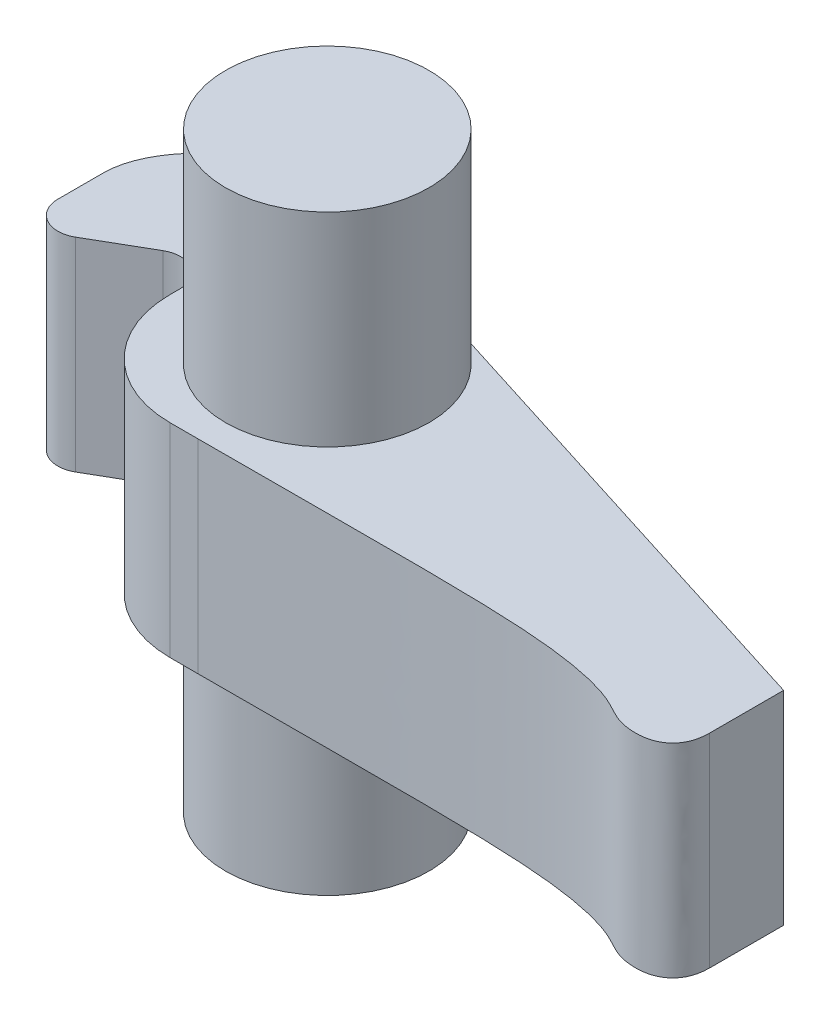
ISO-10303-21;
HEADER;
FILE_DESCRIPTION(('STEP AP214'),'2;1');
FILE_NAME('part.step','',(''),(''),'','','');
FILE_SCHEMA(('AUTOMOTIVE_DESIGN { 1 0 10303 214 1 1 1 1 }'));
ENDSEC;
DATA;
#1=APPLICATION_CONTEXT('core data for automotive mechanical design processes');
#2=APPLICATION_PROTOCOL_DEFINITION('international standard','automotive_design',2000,#1);
#3=PRODUCT_CONTEXT('',#1,'mechanical');
#4=PRODUCT('Part','Part','',(#3));
#5=PRODUCT_RELATED_PRODUCT_CATEGORY('part','',(#4));
#6=PRODUCT_DEFINITION_FORMATION('','',#4);
#7=PRODUCT_DEFINITION_CONTEXT('part definition',#1,'design');
#8=PRODUCT_DEFINITION('design','',#6,#7);
#9=PRODUCT_DEFINITION_SHAPE('','',#8);
#10=(LENGTH_UNIT() NAMED_UNIT(*) SI_UNIT(.MILLI.,.METRE.));
#11=(NAMED_UNIT(*) PLANE_ANGLE_UNIT() SI_UNIT($,.RADIAN.));
#12=(NAMED_UNIT(*) SI_UNIT($,.STERADIAN.) SOLID_ANGLE_UNIT());
#13=UNCERTAINTY_MEASURE_WITH_UNIT(LENGTH_MEASURE(1.E-05),#10,'distance_accuracy_value','');
#14=(GEOMETRIC_REPRESENTATION_CONTEXT(3) GLOBAL_UNCERTAINTY_ASSIGNED_CONTEXT((#13)) GLOBAL_UNIT_ASSIGNED_CONTEXT((#10,
#11,#12)) REPRESENTATION_CONTEXT('',''));
#15=CARTESIAN_POINT('',(0.,0.,0.));
#16=DIRECTION('',(0.,0.,1.));
#17=DIRECTION('',(1.,0.,0.));
#18=AXIS2_PLACEMENT_3D('',#15,#16,#17);
#19=CARTESIAN_POINT('',(-3.,2.2,0.));
#20=DIRECTION('',(1.,0.,0.));
#21=DIRECTION('',(0.,0.,-1.));
#22=AXIS2_PLACEMENT_3D('',#19,#20,#21);
#23=PLANE('',#22);
#24=DIRECTION('',(0.,0.,1.));
#25=VECTOR('',#24,1.);
#26=CARTESIAN_POINT('',(-3.,0.,0.));
#27=LINE('',#26,#25);
#28=CARTESIAN_POINT('',(-3.,0.,-0.587196294450365));
#29=VERTEX_POINT('',#28);
#30=CARTESIAN_POINT('',(-3.,0.,-0.086393689756276));
#31=VERTEX_POINT('',#30);
#32=EDGE_CURVE('E220',#29,#31,#27,.T.);
#33=ORIENTED_EDGE('',*,*,#32,.T.);
#34=DIRECTION('',(0.,-1.,0.));
#35=VECTOR('',#34,1.);
#36=CARTESIAN_POINT('',(-3.,2.2,-0.086393689756276));
#37=LINE('',#36,#35);
#38=CARTESIAN_POINT('',(-3.,2.2,-0.086393689756276));
#39=VERTEX_POINT('',#38);
#40=EDGE_CURVE('E275',#39,#31,#37,.T.);
#41=ORIENTED_EDGE('',*,*,#40,.F.);
#42=DIRECTION('',(0.,0.,1.));
#43=VECTOR('',#42,1.);
#44=CARTESIAN_POINT('',(-3.,2.2,0.));
#45=LINE('',#44,#43);
#46=CARTESIAN_POINT('',(-3.,2.2,-0.587196294450365));
#47=VERTEX_POINT('',#46);
#48=EDGE_CURVE('E280',#47,#39,#45,.T.);
#49=ORIENTED_EDGE('',*,*,#48,.F.);
#50=DIRECTION('',(0.,-1.,0.));
#51=VECTOR('',#50,1.);
#52=CARTESIAN_POINT('',(-3.,2.2,-0.587196294450365));
#53=LINE('',#52,#51);
#54=EDGE_CURVE('E96',#47,#29,#53,.T.);
#55=ORIENTED_EDGE('',*,*,#54,.T.);
#56=EDGE_LOOP('',(#33,#41,#49,#55));
#57=FACE_BOUND('',#56,.T.);
#58=ADVANCED_FACE('F87',(#57),#23,.F.);
#59=CARTESIAN_POINT('',(-2.7,2.2,-0.086393689756276));
#60=DIRECTION('',(0.,-1.,0.));
#61=DIRECTION('',(0.,0.,-1.));
#62=AXIS2_PLACEMENT_3D('',#59,#60,#61);
#63=CYLINDRICAL_SURFACE('',#62,0.3);
#64=CARTESIAN_POINT('',(-2.7,0.,-0.086393689756276));
#65=DIRECTION('',(0.,1.,0.));
#66=DIRECTION('',(0.,0.,1.));
#67=AXIS2_PLACEMENT_3D('',#64,#65,#66);
#68=CIRCLE('',#67,0.3);
#69=CARTESIAN_POINT('',(-2.55,0.,0.173413931379054));
#70=VERTEX_POINT('',#69);
#71=EDGE_CURVE('E225',#31,#70,#68,.T.);
#72=ORIENTED_EDGE('',*,*,#71,.T.);
#73=DIRECTION('',(0.,-1.,0.));
#74=VECTOR('',#73,1.);
#75=CARTESIAN_POINT('',(-2.55,2.2,0.173413931379054));
#76=LINE('',#75,#74);
#77=CARTESIAN_POINT('',(-2.55,2.2,0.173413931379054));
#78=VERTEX_POINT('',#77);
#79=EDGE_CURVE('E272',#78,#70,#76,.T.);
#80=ORIENTED_EDGE('',*,*,#79,.F.);
#81=CARTESIAN_POINT('',(-2.7,2.2,-0.086393689756276));
#82=DIRECTION('',(0.,1.,0.));
#83=DIRECTION('',(0.,0.,1.));
#84=AXIS2_PLACEMENT_3D('',#81,#82,#83);
#85=CIRCLE('',#84,0.3);
#86=EDGE_CURVE('E348',#39,#78,#85,.T.);
#87=ORIENTED_EDGE('',*,*,#86,.F.);
#88=ORIENTED_EDGE('',*,*,#40,.T.);
#89=EDGE_LOOP('',(#72,#80,#87,#88));
#90=FACE_BOUND('',#89,.T.);
#91=ADVANCED_FACE('F297',(#90),#63,.T.);
#92=CARTESIAN_POINT('',(-0.562409565027815,2.2,-0.974121941290875));
#93=DIRECTION('',(-0.500000000000005,0.,-0.866025403784436));
#94=DIRECTION('',(-0.866025403784436,0.,0.500000000000005));
#95=AXIS2_PLACEMENT_3D('',#92,#93,#94);
#96=PLANE('',#95);
#97=DIRECTION('',(0.866025403784436,0.,-0.500000000000005));
#98=VECTOR('',#97,1.);
#99=CARTESIAN_POINT('',(-0.562409565027815,0.,-0.974121941290875));
#100=LINE('',#99,#98);
#101=CARTESIAN_POINT('',(-1.95,0.,-0.172996230134723));
#102=VERTEX_POINT('',#101);
#103=EDGE_CURVE('E227',#70,#102,#100,.T.);
#104=ORIENTED_EDGE('',*,*,#103,.T.);
#105=DIRECTION('',(0.,-1.,0.));
#106=VECTOR('',#105,1.);
#107=CARTESIAN_POINT('',(-1.95,2.2,-0.172996230134723));
#108=LINE('',#107,#106);
#109=CARTESIAN_POINT('',(-1.95,2.2,-0.172996230134723));
#110=VERTEX_POINT('',#109);
#111=EDGE_CURVE('E269',#110,#102,#108,.T.);
#112=ORIENTED_EDGE('',*,*,#111,.F.);
#113=DIRECTION('',(0.866025403784436,0.,-0.500000000000005));
#114=VECTOR('',#113,1.);
#115=CARTESIAN_POINT('',(-0.562409565027815,2.2,-0.974121941290875));
#116=LINE('',#115,#114);
#117=EDGE_CURVE('E346',#78,#110,#116,.T.);
#118=ORIENTED_EDGE('',*,*,#117,.F.);
#119=ORIENTED_EDGE('',*,*,#79,.T.);
#120=EDGE_LOOP('',(#104,#112,#118,#119));
#121=FACE_BOUND('',#120,.T.);
#122=ADVANCED_FACE('F301',(#121),#96,.F.);
#123=CARTESIAN_POINT('',(-1.8,2.2,0.0868113910006078));
#124=DIRECTION('',(0.,-1.,0.));
#125=DIRECTION('',(0.,0.,-1.));
#126=AXIS2_PLACEMENT_3D('',#123,#124,#125);
#127=CYLINDRICAL_SURFACE('',#126,0.3);
#128=CARTESIAN_POINT('',(-1.8,0.,0.0868113910006078));
#129=DIRECTION('',(0.,1.,0.));
#130=DIRECTION('',(0.,0.,1.));
#131=AXIS2_PLACEMENT_3D('',#128,#129,#130);
#132=CIRCLE('',#131,0.3);
#133=CARTESIAN_POINT('',(-1.5,0.,0.0868113910006077));
#134=VERTEX_POINT('',#133);
#135=EDGE_CURVE('E229',#102,#134,#132,.F.);
#136=ORIENTED_EDGE('',*,*,#135,.T.);
#137=DIRECTION('',(0.,-1.,0.));
#138=VECTOR('',#137,1.);
#139=CARTESIAN_POINT('',(-1.5,2.2,0.0868113910006077));
#140=LINE('',#139,#138);
#141=CARTESIAN_POINT('',(-1.5,2.2,0.0868113910006077));
#142=VERTEX_POINT('',#141);
#143=EDGE_CURVE('E266',#142,#134,#140,.T.);
#144=ORIENTED_EDGE('',*,*,#143,.F.);
#145=CARTESIAN_POINT('',(-1.8,2.2,0.0868113910006078));
#146=DIRECTION('',(0.,1.,0.));
#147=DIRECTION('',(0.,0.,1.));
#148=AXIS2_PLACEMENT_3D('',#145,#146,#147);
#149=CIRCLE('',#148,0.3);
#150=EDGE_CURVE('E344',#110,#142,#149,.F.);
#151=ORIENTED_EDGE('',*,*,#150,.F.);
#152=ORIENTED_EDGE('',*,*,#111,.T.);
#153=EDGE_LOOP('',(#136,#144,#151,#152));
#154=FACE_BOUND('',#153,.T.);
#155=ADVANCED_FACE('F307',(#154),#127,.F.);
#156=CARTESIAN_POINT('',(-1.5,2.2,0.));
#157=DIRECTION('',(1.,0.,0.));
#158=DIRECTION('',(0.,0.,-1.));
#159=AXIS2_PLACEMENT_3D('',#156,#157,#158);
#160=PLANE('',#159);
#161=DIRECTION('',(0.,0.,1.));
#162=VECTOR('',#161,1.);
#163=CARTESIAN_POINT('',(-1.5,0.,0.));
#164=LINE('',#163,#162);
#165=CARTESIAN_POINT('',(-1.5,0.,0.2));
#166=VERTEX_POINT('',#165);
#167=EDGE_CURVE('E231',#134,#166,#164,.T.);
#168=ORIENTED_EDGE('',*,*,#167,.T.);
#169=DIRECTION('',(0.,-1.,0.));
#170=VECTOR('',#169,1.);
#171=CARTESIAN_POINT('',(-1.5,2.2,0.2));
#172=LINE('',#171,#170);
#173=CARTESIAN_POINT('',(-1.5,2.2,0.2));
#174=VERTEX_POINT('',#173);
#175=EDGE_CURVE('E264',#174,#166,#172,.T.);
#176=ORIENTED_EDGE('',*,*,#175,.F.);
#177=DIRECTION('',(0.,0.,1.));
#178=VECTOR('',#177,1.);
#179=CARTESIAN_POINT('',(-1.5,2.2,0.));
#180=LINE('',#179,#178);
#181=EDGE_CURVE('E342',#142,#174,#180,.T.);
#182=ORIENTED_EDGE('',*,*,#181,.F.);
#183=ORIENTED_EDGE('',*,*,#143,.T.);
#184=EDGE_LOOP('',(#168,#176,#182,#183));
#185=FACE_BOUND('',#184,.T.);
#186=ADVANCED_FACE('F311',(#185),#160,.F.);
#187=CARTESIAN_POINT('',(-0.3,2.2,0.2));
#188=DIRECTION('',(0.,-1.,0.));
#189=DIRECTION('',(0.,0.,-1.));
#190=AXIS2_PLACEMENT_3D('',#187,#188,#189);
#191=CYLINDRICAL_SURFACE('',#190,1.2);
#192=CARTESIAN_POINT('',(-0.3,0.,0.2));
#193=DIRECTION('',(0.,1.,0.));
#194=DIRECTION('',(0.,0.,1.));
#195=AXIS2_PLACEMENT_3D('',#192,#193,#194);
#196=CIRCLE('',#195,1.2);
#197=CARTESIAN_POINT('',(-0.3,0.,1.4));
#198=VERTEX_POINT('',#197);
#199=EDGE_CURVE('E234',#198,#166,#196,.F.);
#200=ORIENTED_EDGE('',*,*,#199,.F.);
#201=DIRECTION('',(0.,-1.,0.));
#202=VECTOR('',#201,1.);
#203=CARTESIAN_POINT('',(-0.3,2.2,1.4));
#204=LINE('',#203,#202);
#205=CARTESIAN_POINT('',(-0.3,2.2,1.4));
#206=VERTEX_POINT('',#205);
#207=EDGE_CURVE('E262',#206,#198,#204,.T.);
#208=ORIENTED_EDGE('',*,*,#207,.F.);
#209=CARTESIAN_POINT('',(-0.3,2.2,0.2));
#210=DIRECTION('',(0.,1.,0.));
#211=DIRECTION('',(0.,0.,1.));
#212=AXIS2_PLACEMENT_3D('',#209,#210,#211);
#213=CIRCLE('',#212,1.2);
#214=EDGE_CURVE('E339',#206,#174,#213,.F.);
#215=ORIENTED_EDGE('',*,*,#214,.T.);
#216=ORIENTED_EDGE('',*,*,#175,.T.);
#217=EDGE_LOOP('',(#200,#208,#215,#216));
#218=FACE_BOUND('',#217,.T.);
#219=ADVANCED_FACE('F315',(#218),#191,.T.);
#220=CARTESIAN_POINT('',(0.,2.2,1.4));
#221=DIRECTION('',(0.,0.,1.));
#222=DIRECTION('',(1.,0.,0.));
#223=AXIS2_PLACEMENT_3D('',#220,#221,#222);
#224=PLANE('',#223);
#225=DIRECTION('',(-1.,0.,0.));
#226=VECTOR('',#225,1.);
#227=CARTESIAN_POINT('',(0.,0.,1.4));
#228=LINE('',#227,#226);
#229=CARTESIAN_POINT('',(0.,0.,1.4));
#230=VERTEX_POINT('',#229);
#231=EDGE_CURVE('E237',#230,#198,#228,.T.);
#232=ORIENTED_EDGE('',*,*,#231,.F.);
#233=DIRECTION('',(0.,-1.,0.));
#234=VECTOR('',#233,1.);
#235=CARTESIAN_POINT('',(0.,2.2,1.4));
#236=LINE('',#235,#234);
#237=CARTESIAN_POINT('',(0.,2.2,1.4));
#238=VERTEX_POINT('',#237);
#239=EDGE_CURVE('E260',#238,#230,#236,.T.);
#240=ORIENTED_EDGE('',*,*,#239,.F.);
#241=DIRECTION('',(-1.,0.,0.));
#242=VECTOR('',#241,1.);
#243=CARTESIAN_POINT('',(0.,2.2,1.4));
#244=LINE('',#243,#242);
#245=EDGE_CURVE('E333',#238,#206,#244,.T.);
#246=ORIENTED_EDGE('',*,*,#245,.T.);
#247=ORIENTED_EDGE('',*,*,#207,.T.);
#248=EDGE_LOOP('',(#232,#240,#246,#247));
#249=FACE_BOUND('',#248,.T.);
#250=ADVANCED_FACE('F319',(#249),#224,.T.);
#251=CARTESIAN_POINT('',(5.52358793930377,2.2,1.38916862779242));
#252=CARTESIAN_POINT('',(5.52358793930377,2.2,1.65564458196359));
#253=CARTESIAN_POINT('',(5.31087633005542,2.2,1.8018261596441));
#254=CARTESIAN_POINT('',(4.79158078462507,2.2,1.77336774710911));
#255=CARTESIAN_POINT('',(4.77273176011014,2.2,1.59674075043952));
#256=CARTESIAN_POINT('',(3.41513568844589,2.2,1.36800850713413));
#257=CARTESIAN_POINT('',(2.10000000000128,2.2,1.4));
#258=CARTESIAN_POINT('',(0.,2.2,1.4));
#259=B_SPLINE_CURVE_WITH_KNOTS('',3,(#251,#252,#253,#254,#255,#256,#257,#258),.UNSPECIFIED.,.F.,
.F.,(4,1,1,1,1,4),(0.,0.200930821168348,0.262112326290482,0.572959192895685,0.650633546099201,
1.),.UNSPECIFIED.);
#260=DIRECTION('',(0.,-1.,0.));
#261=VECTOR('',#260,1.);
#262=SURFACE_OF_LINEAR_EXTRUSION('',#259,#261);
#263=CARTESIAN_POINT('',(5.52358793930377,0.,1.38916862779242));
#264=CARTESIAN_POINT('',(5.52358793930377,0.,1.65564458196359));
#265=CARTESIAN_POINT('',(5.31087633005542,0.,1.8018261596441));
#266=CARTESIAN_POINT('',(4.79158078462507,0.,1.77336774710911));
#267=CARTESIAN_POINT('',(4.77273176011014,0.,1.59674075043952));
#268=CARTESIAN_POINT('',(3.41513568844589,0.,1.36800850713413));
#269=CARTESIAN_POINT('',(2.10000000000128,0.,1.4));
#270=CARTESIAN_POINT('',(0.,0.,1.4));
#271=B_SPLINE_CURVE_WITH_KNOTS('',3,(#263,#264,#265,#266,#267,#268,#269,#270),.UNSPECIFIED.,.F.,
.F.,(4,1,1,1,1,4),(0.,0.200930821168348,0.262112326290482,0.572959192895685,0.650633546099201,
1.),.UNSPECIFIED.);
#272=CARTESIAN_POINT('',(5.52358793930377,0.,1.38916862779242));
#273=VERTEX_POINT('',#272);
#274=EDGE_CURVE('E240',#273,#230,#271,.T.);
#275=ORIENTED_EDGE('',*,*,#274,.F.);
#276=DIRECTION('',(0.,-1.,0.));
#277=VECTOR('',#276,1.);
#278=CARTESIAN_POINT('',(5.52358793930377,2.2,1.38916862779242));
#279=LINE('',#278,#277);
#280=CARTESIAN_POINT('',(5.52358793930377,2.2,1.38916862779242));
#281=VERTEX_POINT('',#280);
#282=EDGE_CURVE('E197',#281,#273,#279,.T.);
#283=ORIENTED_EDGE('',*,*,#282,.F.);
#284=EDGE_CURVE('E208',#281,#238,#259,.T.);
#285=ORIENTED_EDGE('',*,*,#284,.T.);
#286=ORIENTED_EDGE('',*,*,#239,.T.);
#287=EDGE_LOOP('',(#275,#283,#285,#286));
#288=FACE_BOUND('',#287,.T.);
#289=ADVANCED_FACE('F323',(#288),#262,.T.);
#290=CARTESIAN_POINT('',(5.52358793930377,2.2,0.));
#291=DIRECTION('',(1.,0.,0.));
#292=DIRECTION('',(0.,0.,-1.));
#293=AXIS2_PLACEMENT_3D('',#290,#291,#292);
#294=PLANE('',#293);
#295=DIRECTION('',(0.,0.,1.));
#296=VECTOR('',#295,1.);
#297=CARTESIAN_POINT('',(5.52358793930377,0.,0.));
#298=LINE('',#297,#296);
#299=CARTESIAN_POINT('',(5.52358793930377,0.,0.589168627792421));
#300=VERTEX_POINT('',#299);
#301=EDGE_CURVE('E193',#300,#273,#298,.T.);
#302=ORIENTED_EDGE('',*,*,#301,.F.);
#303=DIRECTION('',(0.,-1.,0.));
#304=VECTOR('',#303,1.);
#305=CARTESIAN_POINT('',(5.52358793930377,2.2,0.589168627792421));
#306=LINE('',#305,#304);
#307=CARTESIAN_POINT('',(5.52358793930377,2.2,0.589168627792421));
#308=VERTEX_POINT('',#307);
#309=EDGE_CURVE('E188',#308,#300,#306,.T.);
#310=ORIENTED_EDGE('',*,*,#309,.F.);
#311=DIRECTION('',(0.,0.,1.));
#312=VECTOR('',#311,1.);
#313=CARTESIAN_POINT('',(5.52358793930377,2.2,0.));
#314=LINE('',#313,#312);
#315=EDGE_CURVE('E191',#308,#281,#314,.T.);
#316=ORIENTED_EDGE('',*,*,#315,.T.);
#317=ORIENTED_EDGE('',*,*,#282,.T.);
#318=EDGE_LOOP('',(#302,#310,#316,#317));
#319=FACE_BOUND('',#318,.T.);
#320=ADVANCED_FACE('F190',(#319),#294,.T.);
#321=CARTESIAN_POINT('',(0.33049817253701,2.2,-1.04820628620895));
#322=DIRECTION('',(0.300705799504267,0.,-0.953716950748229));
#323=DIRECTION('',(-0.953716950748229,0.,-0.300705799504267));
#324=AXIS2_PLACEMENT_3D('',#321,#322,#323);
#325=PLANE('',#324);
#326=DIRECTION('',(0.953716950748229,0.,0.300705799504267));
#327=VECTOR('',#326,1.);
#328=CARTESIAN_POINT('',(0.33049817253701,0.,-1.04820628620895));
#329=LINE('',#328,#327);
#330=CARTESIAN_POINT('',(0.373516405263338,0.,-1.03464268953062));
#331=VERTEX_POINT('',#330);
#332=EDGE_CURVE('E249',#331,#300,#329,.T.);
#333=ORIENTED_EDGE('',*,*,#332,.F.);
#334=DIRECTION('',(0.,-1.,0.));
#335=VECTOR('',#334,1.);
#336=CARTESIAN_POINT('',(0.373516405263338,2.2,-1.03464268953062));
#337=LINE('',#336,#335);
#338=CARTESIAN_POINT('',(0.37351640526333,2.2,-1.03464268953062));
#339=VERTEX_POINT('',#338);
#340=EDGE_CURVE('E198',#339,#331,#337,.T.);
#341=ORIENTED_EDGE('',*,*,#340,.F.);
#342=DIRECTION('',(0.953716950748229,0.,0.300705799504267));
#343=VECTOR('',#342,1.);
#344=CARTESIAN_POINT('',(0.33049817253701,2.2,-1.04820628620895));
#345=LINE('',#344,#343);
#346=EDGE_CURVE('E204',#339,#308,#345,.T.);
#347=ORIENTED_EDGE('',*,*,#346,.T.);
#348=ORIENTED_EDGE('',*,*,#309,.T.);
#349=EDGE_LOOP('',(#333,#341,#347,#348));
#350=FACE_BOUND('',#349,.T.);
#351=ADVANCED_FACE('F210',(#350),#325,.T.);
#352=CARTESIAN_POINT('',(0.33049817253701,2.2,-1.04820628620895));
#353=DIRECTION('',(-0.300705799504267,0.,0.953716950748229));
#354=DIRECTION('',(0.953716950748229,0.,0.300705799504267));
#355=AXIS2_PLACEMENT_3D('',#352,#353,#354);
#356=PLANE('',#355);
#357=DIRECTION('',(-0.953716950748229,0.,-0.300705799504267));
#358=VECTOR('',#357,1.);
#359=CARTESIAN_POINT('',(0.33049817253701,0.,-1.04820628620895));
#360=LINE('',#359,#358);
#361=CARTESIAN_POINT('',(0.287479939810679,0.,-1.06176988288727));
#362=VERTEX_POINT('',#361);
#363=CARTESIAN_POINT('',(-1.53391749623312,0.,-1.63605428853915));
#364=VERTEX_POINT('',#363);
#365=EDGE_CURVE('E251',#362,#364,#360,.T.);
#366=ORIENTED_EDGE('',*,*,#365,.T.);
#367=DIRECTION('',(0.,-1.,0.));
#368=VECTOR('',#367,1.);
#369=CARTESIAN_POINT('',(-1.53391749623312,2.2,-1.63605428853915));
#370=LINE('',#369,#368);
#371=CARTESIAN_POINT('',(-1.53391749623312,2.2,-1.63605428853915));
#372=VERTEX_POINT('',#371);
#373=EDGE_CURVE('E153',#372,#364,#370,.T.);
#374=ORIENTED_EDGE('',*,*,#373,.F.);
#375=DIRECTION('',(-0.953716950748229,0.,-0.300705799504267));
#376=VECTOR('',#375,1.);
#377=CARTESIAN_POINT('',(0.33049817253701,2.2,-1.04820628620895));
#378=LINE('',#377,#376);
#379=CARTESIAN_POINT('',(0.28747993981069,2.2,-1.06176988288727));
#380=VERTEX_POINT('',#379);
#381=EDGE_CURVE('E104',#380,#372,#378,.T.);
#382=ORIENTED_EDGE('',*,*,#381,.F.);
#383=DIRECTION('',(0.,-1.,0.));
#384=VECTOR('',#383,1.);
#385=CARTESIAN_POINT('',(0.28747993981069,2.2,-1.06176988288727));
#386=LINE('',#385,#384);
#387=EDGE_CURVE('E255',#380,#362,#386,.T.);
#388=ORIENTED_EDGE('',*,*,#387,.T.);
#389=EDGE_LOOP('',(#366,#374,#382,#388));
#390=FACE_BOUND('',#389,.T.);
#391=ADVANCED_FACE('F286',(#390),#356,.F.);
#392=CARTESIAN_POINT('',(-3.,2.2,-0.587196294450365));
#393=CARTESIAN_POINT('',(-2.99309316393838,2.2,-1.20502359302415));
#394=CARTESIAN_POINT('',(-2.17796828739402,2.2,-1.83912272296873));
#395=CARTESIAN_POINT('',(-1.53391749623312,2.2,-1.63605428853915));
#396=B_SPLINE_CURVE_WITH_KNOTS('',3,(#392,#393,#394,#395),.UNSPECIFIED.,.F.,.F.,(4,4),(0.,1.),.UNSPECIFIED.);
#397=DIRECTION('',(0.,-1.,0.));
#398=VECTOR('',#397,1.);
#399=SURFACE_OF_LINEAR_EXTRUSION('',#396,#398);
#400=CARTESIAN_POINT('',(-3.,0.,-0.587196294450365));
#401=CARTESIAN_POINT('',(-2.99309316393838,0.,-1.20502359302415));
#402=CARTESIAN_POINT('',(-2.17796828739402,0.,-1.83912272296873));
#403=CARTESIAN_POINT('',(-1.53391749623312,0.,-1.63605428853915));
#404=B_SPLINE_CURVE_WITH_KNOTS('',3,(#400,#401,#402,#403),.UNSPECIFIED.,.F.,.F.,(4,4),(0.,1.),.UNSPECIFIED.);
#405=EDGE_CURVE('E215',#29,#364,#404,.T.);
#406=ORIENTED_EDGE('',*,*,#405,.F.);
#407=ORIENTED_EDGE('',*,*,#54,.F.);
#408=EDGE_CURVE('E253',#47,#372,#396,.T.);
#409=ORIENTED_EDGE('',*,*,#408,.T.);
#410=ORIENTED_EDGE('',*,*,#373,.T.);
#411=EDGE_LOOP('',(#406,#407,#409,#410));
#412=FACE_BOUND('',#411,.T.);
#413=ADVANCED_FACE('F284',(#412),#399,.T.);
#414=CARTESIAN_POINT('',(0.,0.,0.));
#415=DIRECTION('',(0.,1.,0.));
#416=DIRECTION('',(0.,0.,1.));
#417=AXIS2_PLACEMENT_3D('',#414,#415,#416);
#418=PLANE('',#417);
#419=ORIENTED_EDGE('',*,*,#365,.F.);
#420=CARTESIAN_POINT('',(0.,0.,0.));
#421=DIRECTION('',(0.,1.,0.));
#422=DIRECTION('',(0.,0.,1.));
#423=AXIS2_PLACEMENT_3D('',#420,#421,#422);
#424=CIRCLE('',#423,1.1);
#425=EDGE_CURVE('E146',#362,#331,#424,.T.);
#426=ORIENTED_EDGE('',*,*,#425,.T.);
#427=ORIENTED_EDGE('',*,*,#332,.T.);
#428=ORIENTED_EDGE('',*,*,#301,.T.);
#429=ORIENTED_EDGE('',*,*,#274,.T.);
#430=ORIENTED_EDGE('',*,*,#231,.T.);
#431=ORIENTED_EDGE('',*,*,#199,.T.);
#432=ORIENTED_EDGE('',*,*,#167,.F.);
#433=ORIENTED_EDGE('',*,*,#135,.F.);
#434=ORIENTED_EDGE('',*,*,#103,.F.);
#435=ORIENTED_EDGE('',*,*,#71,.F.);
#436=ORIENTED_EDGE('',*,*,#32,.F.);
#437=ORIENTED_EDGE('',*,*,#405,.T.);
#438=EDGE_LOOP('',(#419,#426,#427,#428,#429,#430,#431,#432,#433,#434,#435,#436,#437));
#439=FACE_BOUND('',#438,.T.);
#440=ADVANCED_FACE('F282',(#439),#418,.F.);
#441=CARTESIAN_POINT('',(0.,2.2,0.));
#442=DIRECTION('',(0.,1.,0.));
#443=DIRECTION('',(0.,0.,1.));
#444=AXIS2_PLACEMENT_3D('',#441,#442,#443);
#445=PLANE('',#444);
#446=CARTESIAN_POINT('',(0.,2.2,0.));
#447=DIRECTION('',(0.,1.,0.));
#448=DIRECTION('',(0.,0.,1.));
#449=AXIS2_PLACEMENT_3D('',#446,#447,#448);
#450=CIRCLE('',#449,1.1);
#451=EDGE_CURVE('E12',#380,#339,#450,.T.);
#452=ORIENTED_EDGE('',*,*,#451,.F.);
#453=ORIENTED_EDGE('',*,*,#381,.T.);
#454=ORIENTED_EDGE('',*,*,#408,.F.);
#455=ORIENTED_EDGE('',*,*,#48,.T.);
#456=ORIENTED_EDGE('',*,*,#86,.T.);
#457=ORIENTED_EDGE('',*,*,#117,.T.);
#458=ORIENTED_EDGE('',*,*,#150,.T.);
#459=ORIENTED_EDGE('',*,*,#181,.T.);
#460=ORIENTED_EDGE('',*,*,#214,.F.);
#461=ORIENTED_EDGE('',*,*,#245,.F.);
#462=ORIENTED_EDGE('',*,*,#284,.F.);
#463=ORIENTED_EDGE('',*,*,#315,.F.);
#464=ORIENTED_EDGE('',*,*,#346,.F.);
#465=EDGE_LOOP('',(#452,#453,#454,#455,#456,#457,#458,#459,#460,#461,#462,#463,#464));
#466=FACE_BOUND('',#465,.T.);
#467=ADVANCED_FACE('F202',(#466),#445,.T.);
#468=CARTESIAN_POINT('',(0.,2.2,0.));
#469=DIRECTION('',(0.,-1.,0.));
#470=DIRECTION('',(0.,0.,-1.));
#471=AXIS2_PLACEMENT_3D('',#468,#469,#470);
#472=CYLINDRICAL_SURFACE('',#471,1.1);
#473=ORIENTED_EDGE('',*,*,#340,.T.);
#474=ORIENTED_EDGE('',*,*,#425,.F.);
#475=ORIENTED_EDGE('',*,*,#387,.F.);
#476=ORIENTED_EDGE('',*,*,#451,.T.);
#477=EDGE_LOOP('',(#473,#474,#475,#476));
#478=FACE_BOUND('',#477,.T.);
#479=CARTESIAN_POINT('',(0.,4.4,0.));
#480=DIRECTION('',(0.,1.,0.));
#481=DIRECTION('',(0.,0.,1.));
#482=AXIS2_PLACEMENT_3D('',#479,#480,#481);
#483=CIRCLE('',#482,1.1);
#484=CARTESIAN_POINT('',(0.,4.4,1.1));
#485=VERTEX_POINT('',#484);
#486=EDGE_CURVE('E361',#485,#485,#483,.T.);
#487=ORIENTED_EDGE('',*,*,#486,.F.);
#488=EDGE_LOOP('',(#487));
#489=FACE_BOUND('',#488,.T.);
#490=CARTESIAN_POINT('',(0.,-2.,0.));
#491=DIRECTION('',(0.,1.,0.));
#492=DIRECTION('',(0.,0.,1.));
#493=AXIS2_PLACEMENT_3D('',#490,#491,#492);
#494=CIRCLE('',#493,1.1);
#495=CARTESIAN_POINT('',(0.,-2.,1.1));
#496=VERTEX_POINT('',#495);
#497=EDGE_CURVE('E358',#496,#496,#494,.T.);
#498=ORIENTED_EDGE('',*,*,#497,.T.);
#499=EDGE_LOOP('',(#498));
#500=FACE_BOUND('',#499,.T.);
#501=ADVANCED_FACE('F89',(#478,#489,#500),#472,.T.);
#502=CARTESIAN_POINT('',(0.,4.4,0.));
#503=DIRECTION('',(0.,1.,0.));
#504=DIRECTION('',(0.,0.,1.));
#505=AXIS2_PLACEMENT_3D('',#502,#503,#504);
#506=PLANE('',#505);
#507=ORIENTED_EDGE('',*,*,#486,.T.);
#508=EDGE_LOOP('',(#507));
#509=FACE_BOUND('',#508,.T.);
#510=ADVANCED_FACE('F365',(#509),#506,.T.);
#511=CARTESIAN_POINT('',(0.,-2.,0.));
#512=DIRECTION('',(0.,1.,0.));
#513=DIRECTION('',(0.,0.,1.));
#514=AXIS2_PLACEMENT_3D('',#511,#512,#513);
#515=PLANE('',#514);
#516=ORIENTED_EDGE('',*,*,#497,.F.);
#517=EDGE_LOOP('',(#516));
#518=FACE_BOUND('',#517,.T.);
#519=ADVANCED_FACE('F372',(#518),#515,.F.);
#520=CLOSED_SHELL('',(#58,#91,#122,#155,#186,#219,#250,#289,#320,#351,#391,#413,#440,#467,#501,
#510,#519));
#521=MANIFOLD_SOLID_BREP('B2',#520);
#522=ADVANCED_BREP_SHAPE_REPRESENTATION('',(#18,#521),#14);
#523=SHAPE_DEFINITION_REPRESENTATION(#9,#522);
ENDSEC;
END-ISO-10303-21;
